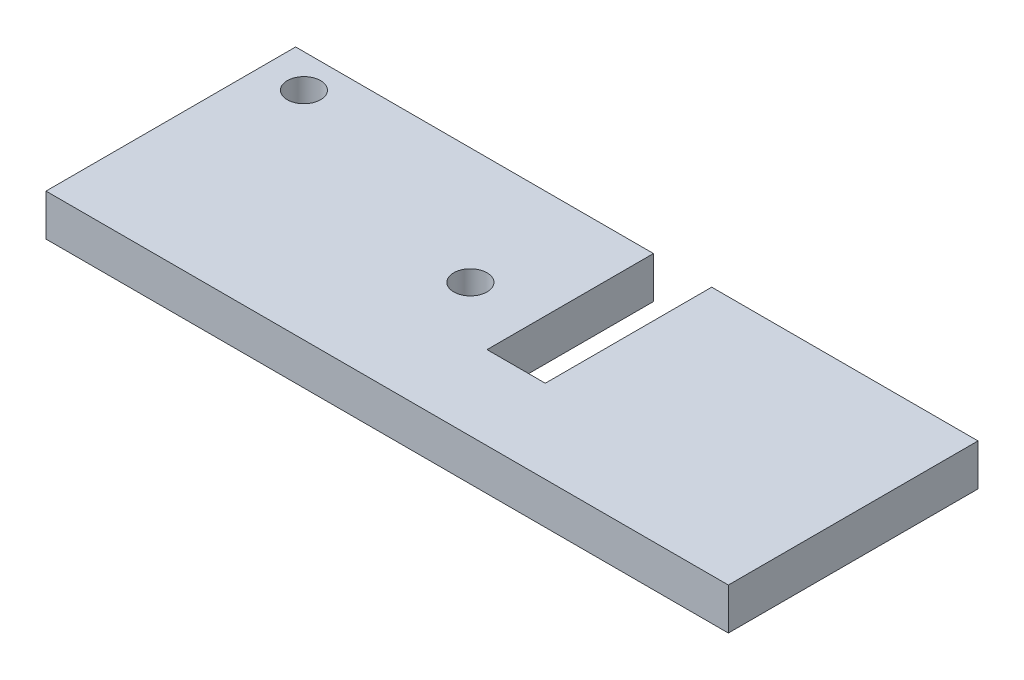
ISO-10303-21;
HEADER;
FILE_DESCRIPTION(('STEP AP214'),'2;1');
FILE_NAME('part.step','',(''),(''),'','','');
FILE_SCHEMA(('AUTOMOTIVE_DESIGN { 1 0 10303 214 1 1 1 1 }'));
ENDSEC;
DATA;
#1=APPLICATION_CONTEXT('core data for automotive mechanical design processes');
#2=APPLICATION_PROTOCOL_DEFINITION('international standard','automotive_design',2000,#1);
#3=PRODUCT_CONTEXT('',#1,'mechanical');
#4=PRODUCT('Part','Part','',(#3));
#5=PRODUCT_RELATED_PRODUCT_CATEGORY('part','',(#4));
#6=PRODUCT_DEFINITION_FORMATION('','',#4);
#7=PRODUCT_DEFINITION_CONTEXT('part definition',#1,'design');
#8=PRODUCT_DEFINITION('design','',#6,#7);
#9=PRODUCT_DEFINITION_SHAPE('','',#8);
#10=(LENGTH_UNIT() NAMED_UNIT(*) SI_UNIT(.MILLI.,.METRE.));
#11=(NAMED_UNIT(*) PLANE_ANGLE_UNIT() SI_UNIT($,.RADIAN.));
#12=(NAMED_UNIT(*) SI_UNIT($,.STERADIAN.) SOLID_ANGLE_UNIT());
#13=UNCERTAINTY_MEASURE_WITH_UNIT(LENGTH_MEASURE(1.E-05),#10,'distance_accuracy_value','');
#14=(GEOMETRIC_REPRESENTATION_CONTEXT(3) GLOBAL_UNCERTAINTY_ASSIGNED_CONTEXT((#13)) GLOBAL_UNIT_ASSIGNED_CONTEXT((#10,
#11,#12)) REPRESENTATION_CONTEXT('',''));
#15=CARTESIAN_POINT('',(0.,0.,0.));
#16=DIRECTION('',(0.,0.,1.));
#17=DIRECTION('',(1.,0.,0.));
#18=AXIS2_PLACEMENT_3D('',#15,#16,#17);
#19=CARTESIAN_POINT('',(0.,-5.,0.));
#20=DIRECTION('',(-1.,0.,0.));
#21=DIRECTION('',(0.,0.,1.));
#22=AXIS2_PLACEMENT_3D('',#19,#20,#21);
#23=PLANE('',#22);
#24=DIRECTION('',(0.,0.,1.));
#25=VECTOR('',#24,1.);
#26=CARTESIAN_POINT('',(0.,0.,0.));
#27=LINE('',#26,#25);
#28=CARTESIAN_POINT('',(0.,0.,-30.));
#29=VERTEX_POINT('',#28);
#30=CARTESIAN_POINT('',(0.,0.,0.));
#31=VERTEX_POINT('',#30);
#32=EDGE_CURVE('E143',#29,#31,#27,.T.);
#33=ORIENTED_EDGE('',*,*,#32,.F.);
#34=DIRECTION('',(0.,1.,0.));
#35=VECTOR('',#34,1.);
#36=CARTESIAN_POINT('',(0.,-5.,-30.));
#37=LINE('',#36,#35);
#38=CARTESIAN_POINT('',(0.,-5.,-30.));
#39=VERTEX_POINT('',#38);
#40=EDGE_CURVE('E11',#39,#29,#37,.T.);
#41=ORIENTED_EDGE('',*,*,#40,.F.);
#42=DIRECTION('',(0.,0.,1.));
#43=VECTOR('',#42,1.);
#44=CARTESIAN_POINT('',(0.,-5.,0.));
#45=LINE('',#44,#43);
#46=CARTESIAN_POINT('',(0.,-5.,0.));
#47=VERTEX_POINT('',#46);
#48=EDGE_CURVE('E172',#39,#47,#45,.T.);
#49=ORIENTED_EDGE('',*,*,#48,.T.);
#50=DIRECTION('',(0.,1.,0.));
#51=VECTOR('',#50,1.);
#52=CARTESIAN_POINT('',(0.,-5.,0.));
#53=LINE('',#52,#51);
#54=EDGE_CURVE('E41',#47,#31,#53,.T.);
#55=ORIENTED_EDGE('',*,*,#54,.T.);
#56=EDGE_LOOP('',(#33,#41,#49,#55));
#57=FACE_BOUND('',#56,.T.);
#58=ADVANCED_FACE('F38',(#57),#23,.T.);
#59=CARTESIAN_POINT('',(0.,-5.,-30.));
#60=DIRECTION('',(0.,0.,-1.));
#61=DIRECTION('',(-1.,0.,0.));
#62=AXIS2_PLACEMENT_3D('',#59,#60,#61);
#63=PLANE('',#62);
#64=DIRECTION('',(-1.,0.,0.));
#65=VECTOR('',#64,1.);
#66=CARTESIAN_POINT('',(0.,0.,-30.));
#67=LINE('',#66,#65);
#68=CARTESIAN_POINT('',(43.,0.,-30.));
#69=VERTEX_POINT('',#68);
#70=EDGE_CURVE('E169',#69,#29,#67,.T.);
#71=ORIENTED_EDGE('',*,*,#70,.F.);
#72=DIRECTION('',(0.,1.,0.));
#73=VECTOR('',#72,1.);
#74=CARTESIAN_POINT('',(43.,-5.,-30.));
#75=LINE('',#74,#73);
#76=CARTESIAN_POINT('',(43.,-5.,-30.));
#77=VERTEX_POINT('',#76);
#78=EDGE_CURVE('E48',#77,#69,#75,.T.);
#79=ORIENTED_EDGE('',*,*,#78,.F.);
#80=DIRECTION('',(-1.,0.,0.));
#81=VECTOR('',#80,1.);
#82=CARTESIAN_POINT('',(0.,-5.,-30.));
#83=LINE('',#82,#81);
#84=EDGE_CURVE('E127',#77,#39,#83,.T.);
#85=ORIENTED_EDGE('',*,*,#84,.T.);
#86=ORIENTED_EDGE('',*,*,#40,.T.);
#87=EDGE_LOOP('',(#71,#79,#85,#86));
#88=FACE_BOUND('',#87,.T.);
#89=ADVANCED_FACE('F194',(#88),#63,.T.);
#90=CARTESIAN_POINT('',(43.,-5.,-30.));
#91=DIRECTION('',(1.,0.,0.));
#92=DIRECTION('',(0.,0.,-1.));
#93=AXIS2_PLACEMENT_3D('',#90,#91,#92);
#94=PLANE('',#93);
#95=DIRECTION('',(0.,0.,-1.));
#96=VECTOR('',#95,1.);
#97=CARTESIAN_POINT('',(43.,0.,-30.));
#98=LINE('',#97,#96);
#99=CARTESIAN_POINT('',(43.,0.,-10.));
#100=VERTEX_POINT('',#99);
#101=EDGE_CURVE('E113',#100,#69,#98,.T.);
#102=ORIENTED_EDGE('',*,*,#101,.F.);
#103=DIRECTION('',(0.,1.,0.));
#104=VECTOR('',#103,1.);
#105=CARTESIAN_POINT('',(43.,-5.,-10.));
#106=LINE('',#105,#104);
#107=CARTESIAN_POINT('',(43.,-5.,-10.));
#108=VERTEX_POINT('',#107);
#109=EDGE_CURVE('E108',#108,#100,#106,.T.);
#110=ORIENTED_EDGE('',*,*,#109,.F.);
#111=DIRECTION('',(0.,0.,-1.));
#112=VECTOR('',#111,1.);
#113=CARTESIAN_POINT('',(43.,-5.,-30.));
#114=LINE('',#113,#112);
#115=EDGE_CURVE('E111',#108,#77,#114,.T.);
#116=ORIENTED_EDGE('',*,*,#115,.T.);
#117=ORIENTED_EDGE('',*,*,#78,.T.);
#118=EDGE_LOOP('',(#102,#110,#116,#117));
#119=FACE_BOUND('',#118,.T.);
#120=ADVANCED_FACE('F110',(#119),#94,.T.);
#121=CARTESIAN_POINT('',(43.,-5.,-10.));
#122=DIRECTION('',(0.,0.,-1.));
#123=DIRECTION('',(-1.,0.,0.));
#124=AXIS2_PLACEMENT_3D('',#121,#122,#123);
#125=PLANE('',#124);
#126=DIRECTION('',(-1.,0.,0.));
#127=VECTOR('',#126,1.);
#128=CARTESIAN_POINT('',(43.,0.,-10.));
#129=LINE('',#128,#127);
#130=CARTESIAN_POINT('',(50.,0.,-10.));
#131=VERTEX_POINT('',#130);
#132=EDGE_CURVE('E164',#131,#100,#129,.T.);
#133=ORIENTED_EDGE('',*,*,#132,.F.);
#134=DIRECTION('',(0.,1.,0.));
#135=VECTOR('',#134,1.);
#136=CARTESIAN_POINT('',(50.,-5.,-10.));
#137=LINE('',#136,#135);
#138=CARTESIAN_POINT('',(50.,-5.,-10.));
#139=VERTEX_POINT('',#138);
#140=EDGE_CURVE('E119',#139,#131,#137,.T.);
#141=ORIENTED_EDGE('',*,*,#140,.F.);
#142=DIRECTION('',(-1.,0.,0.));
#143=VECTOR('',#142,1.);
#144=CARTESIAN_POINT('',(43.,-5.,-10.));
#145=LINE('',#144,#143);
#146=EDGE_CURVE('E125',#139,#108,#145,.T.);
#147=ORIENTED_EDGE('',*,*,#146,.T.);
#148=ORIENTED_EDGE('',*,*,#109,.T.);
#149=EDGE_LOOP('',(#133,#141,#147,#148));
#150=FACE_BOUND('',#149,.T.);
#151=ADVANCED_FACE('F130',(#150),#125,.T.);
#152=CARTESIAN_POINT('',(50.,-5.,-30.));
#153=DIRECTION('',(-1.,0.,0.));
#154=DIRECTION('',(0.,0.,1.));
#155=AXIS2_PLACEMENT_3D('',#152,#153,#154);
#156=PLANE('',#155);
#157=DIRECTION('',(0.,0.,1.));
#158=VECTOR('',#157,1.);
#159=CARTESIAN_POINT('',(50.,0.,-30.));
#160=LINE('',#159,#158);
#161=CARTESIAN_POINT('',(50.,0.,-30.));
#162=VERTEX_POINT('',#161);
#163=EDGE_CURVE('E160',#162,#131,#160,.T.);
#164=ORIENTED_EDGE('',*,*,#163,.F.);
#165=DIRECTION('',(0.,1.,0.));
#166=VECTOR('',#165,1.);
#167=CARTESIAN_POINT('',(50.,-5.,-30.));
#168=LINE('',#167,#166);
#169=CARTESIAN_POINT('',(50.,-5.,-30.));
#170=VERTEX_POINT('',#169);
#171=EDGE_CURVE('E178',#170,#162,#168,.T.);
#172=ORIENTED_EDGE('',*,*,#171,.F.);
#173=DIRECTION('',(0.,0.,1.));
#174=VECTOR('',#173,1.);
#175=CARTESIAN_POINT('',(50.,-5.,-30.));
#176=LINE('',#175,#174);
#177=EDGE_CURVE('E132',#170,#139,#176,.T.);
#178=ORIENTED_EDGE('',*,*,#177,.T.);
#179=ORIENTED_EDGE('',*,*,#140,.T.);
#180=EDGE_LOOP('',(#164,#172,#178,#179));
#181=FACE_BOUND('',#180,.T.);
#182=ADVANCED_FACE('F207',(#181),#156,.T.);
#183=CARTESIAN_POINT('',(50.,-5.,-30.));
#184=DIRECTION('',(0.,0.,-1.));
#185=DIRECTION('',(-1.,0.,0.));
#186=AXIS2_PLACEMENT_3D('',#183,#184,#185);
#187=PLANE('',#186);
#188=DIRECTION('',(-1.,0.,0.));
#189=VECTOR('',#188,1.);
#190=CARTESIAN_POINT('',(50.,0.,-30.));
#191=LINE('',#190,#189);
#192=CARTESIAN_POINT('',(82.,0.,-30.));
#193=VERTEX_POINT('',#192);
#194=EDGE_CURVE('E156',#193,#162,#191,.T.);
#195=ORIENTED_EDGE('',*,*,#194,.F.);
#196=DIRECTION('',(0.,1.,0.));
#197=VECTOR('',#196,1.);
#198=CARTESIAN_POINT('',(82.,-5.,-30.));
#199=LINE('',#198,#197);
#200=CARTESIAN_POINT('',(82.,-5.,-30.));
#201=VERTEX_POINT('',#200);
#202=EDGE_CURVE('E181',#201,#193,#199,.T.);
#203=ORIENTED_EDGE('',*,*,#202,.F.);
#204=DIRECTION('',(-1.,0.,0.));
#205=VECTOR('',#204,1.);
#206=CARTESIAN_POINT('',(50.,-5.,-30.));
#207=LINE('',#206,#205);
#208=EDGE_CURVE('E137',#201,#170,#207,.T.);
#209=ORIENTED_EDGE('',*,*,#208,.T.);
#210=ORIENTED_EDGE('',*,*,#171,.T.);
#211=EDGE_LOOP('',(#195,#203,#209,#210));
#212=FACE_BOUND('',#211,.T.);
#213=ADVANCED_FACE('F210',(#212),#187,.T.);
#214=CARTESIAN_POINT('',(82.,-5.,0.));
#215=DIRECTION('',(1.,0.,0.));
#216=DIRECTION('',(0.,0.,-1.));
#217=AXIS2_PLACEMENT_3D('',#214,#215,#216);
#218=PLANE('',#217);
#219=DIRECTION('',(0.,0.,-1.));
#220=VECTOR('',#219,1.);
#221=CARTESIAN_POINT('',(82.,0.,0.));
#222=LINE('',#221,#220);
#223=CARTESIAN_POINT('',(82.,0.,0.));
#224=VERTEX_POINT('',#223);
#225=EDGE_CURVE('E152',#224,#193,#222,.T.);
#226=ORIENTED_EDGE('',*,*,#225,.F.);
#227=DIRECTION('',(0.,1.,0.));
#228=VECTOR('',#227,1.);
#229=CARTESIAN_POINT('',(82.,-5.,0.));
#230=LINE('',#229,#228);
#231=CARTESIAN_POINT('',(82.,-5.,0.));
#232=VERTEX_POINT('',#231);
#233=EDGE_CURVE('E183',#232,#224,#230,.T.);
#234=ORIENTED_EDGE('',*,*,#233,.F.);
#235=DIRECTION('',(0.,0.,-1.));
#236=VECTOR('',#235,1.);
#237=CARTESIAN_POINT('',(82.,-5.,0.));
#238=LINE('',#237,#236);
#239=EDGE_CURVE('E264',#232,#201,#238,.T.);
#240=ORIENTED_EDGE('',*,*,#239,.T.);
#241=ORIENTED_EDGE('',*,*,#202,.T.);
#242=EDGE_LOOP('',(#226,#234,#240,#241));
#243=FACE_BOUND('',#242,.T.);
#244=ADVANCED_FACE('F214',(#243),#218,.T.);
#245=CARTESIAN_POINT('',(0.,-5.,0.));
#246=DIRECTION('',(0.,0.,1.));
#247=DIRECTION('',(1.,0.,0.));
#248=AXIS2_PLACEMENT_3D('',#245,#246,#247);
#249=PLANE('',#248);
#250=DIRECTION('',(1.,0.,0.));
#251=VECTOR('',#250,1.);
#252=CARTESIAN_POINT('',(0.,0.,0.));
#253=LINE('',#252,#251);
#254=EDGE_CURVE('E147',#31,#224,#253,.T.);
#255=ORIENTED_EDGE('',*,*,#254,.F.);
#256=ORIENTED_EDGE('',*,*,#54,.F.);
#257=DIRECTION('',(1.,0.,0.));
#258=VECTOR('',#257,1.);
#259=CARTESIAN_POINT('',(0.,-5.,0.));
#260=LINE('',#259,#258);
#261=EDGE_CURVE('E261',#47,#232,#260,.T.);
#262=ORIENTED_EDGE('',*,*,#261,.T.);
#263=ORIENTED_EDGE('',*,*,#233,.T.);
#264=EDGE_LOOP('',(#255,#256,#262,#263));
#265=FACE_BOUND('',#264,.T.);
#266=ADVANCED_FACE('F191',(#265),#249,.T.);
#267=CARTESIAN_POINT('',(0.,-5.,0.));
#268=DIRECTION('',(0.,-1.,0.));
#269=DIRECTION('',(0.,0.,-1.));
#270=AXIS2_PLACEMENT_3D('',#267,#268,#269);
#271=PLANE('',#270);
#272=CARTESIAN_POINT('',(35.,-5.,-16.));
#273=DIRECTION('',(0.,1.,0.));
#274=DIRECTION('',(0.,0.,1.));
#275=AXIS2_PLACEMENT_3D('',#272,#273,#274);
#276=CIRCLE('',#275,2.00000000000001);
#277=CARTESIAN_POINT('',(35.,-5.,-14.));
#278=VERTEX_POINT('',#277);
#279=EDGE_CURVE('E241',#278,#278,#276,.T.);
#280=ORIENTED_EDGE('',*,*,#279,.T.);
#281=EDGE_LOOP('',(#280));
#282=FACE_BOUND('',#281,.T.);
#283=CARTESIAN_POINT('',(5.,-5.,-26.));
#284=DIRECTION('',(0.,1.,0.));
#285=DIRECTION('',(0.,0.,1.));
#286=AXIS2_PLACEMENT_3D('',#283,#284,#285);
#287=CIRCLE('',#286,2.);
#288=CARTESIAN_POINT('',(5.,-5.,-24.));
#289=VERTEX_POINT('',#288);
#290=EDGE_CURVE('E148',#289,#289,#287,.T.);
#291=ORIENTED_EDGE('',*,*,#290,.T.);
#292=EDGE_LOOP('',(#291));
#293=FACE_BOUND('',#292,.T.);
#294=ORIENTED_EDGE('',*,*,#48,.F.);
#295=ORIENTED_EDGE('',*,*,#84,.F.);
#296=ORIENTED_EDGE('',*,*,#115,.F.);
#297=ORIENTED_EDGE('',*,*,#146,.F.);
#298=ORIENTED_EDGE('',*,*,#177,.F.);
#299=ORIENTED_EDGE('',*,*,#208,.F.);
#300=ORIENTED_EDGE('',*,*,#239,.F.);
#301=ORIENTED_EDGE('',*,*,#261,.F.);
#302=EDGE_LOOP('',(#294,#295,#296,#297,#298,#299,#300,#301));
#303=FACE_BOUND('',#302,.T.);
#304=ADVANCED_FACE('F123',(#282,#293,#303),#271,.T.);
#305=CARTESIAN_POINT('',(0.,0.,0.));
#306=DIRECTION('',(0.,-1.,0.));
#307=DIRECTION('',(0.,0.,-1.));
#308=AXIS2_PLACEMENT_3D('',#305,#306,#307);
#309=PLANE('',#308);
#310=CARTESIAN_POINT('',(35.,0.,-16.));
#311=DIRECTION('',(0.,1.,0.));
#312=DIRECTION('',(0.,0.,1.));
#313=AXIS2_PLACEMENT_3D('',#310,#311,#312);
#314=CIRCLE('',#313,2.00000000000001);
#315=CARTESIAN_POINT('',(35.,0.,-14.));
#316=VERTEX_POINT('',#315);
#317=EDGE_CURVE('E244',#316,#316,#314,.T.);
#318=ORIENTED_EDGE('',*,*,#317,.F.);
#319=EDGE_LOOP('',(#318));
#320=FACE_BOUND('',#319,.T.);
#321=CARTESIAN_POINT('',(5.,0.,-26.));
#322=DIRECTION('',(0.,1.,0.));
#323=DIRECTION('',(0.,0.,1.));
#324=AXIS2_PLACEMENT_3D('',#321,#322,#323);
#325=CIRCLE('',#324,2.);
#326=CARTESIAN_POINT('',(5.,0.,-24.));
#327=VERTEX_POINT('',#326);
#328=EDGE_CURVE('E250',#327,#327,#325,.T.);
#329=ORIENTED_EDGE('',*,*,#328,.F.);
#330=EDGE_LOOP('',(#329));
#331=FACE_BOUND('',#330,.T.);
#332=ORIENTED_EDGE('',*,*,#32,.T.);
#333=ORIENTED_EDGE('',*,*,#254,.T.);
#334=ORIENTED_EDGE('',*,*,#225,.T.);
#335=ORIENTED_EDGE('',*,*,#194,.T.);
#336=ORIENTED_EDGE('',*,*,#163,.T.);
#337=ORIENTED_EDGE('',*,*,#132,.T.);
#338=ORIENTED_EDGE('',*,*,#101,.T.);
#339=ORIENTED_EDGE('',*,*,#70,.T.);
#340=EDGE_LOOP('',(#332,#333,#334,#335,#336,#337,#338,#339));
#341=FACE_BOUND('',#340,.T.);
#342=ADVANCED_FACE('F193',(#320,#331,#341),#309,.F.);
#343=CARTESIAN_POINT('',(5.,-5.,-26.));
#344=DIRECTION('',(0.,1.,0.));
#345=DIRECTION('',(0.,0.,1.));
#346=AXIS2_PLACEMENT_3D('',#343,#344,#345);
#347=CYLINDRICAL_SURFACE('',#346,2.);
#348=ORIENTED_EDGE('',*,*,#290,.F.);
#349=EDGE_LOOP('',(#348));
#350=FACE_BOUND('',#349,.T.);
#351=ORIENTED_EDGE('',*,*,#328,.T.);
#352=EDGE_LOOP('',(#351));
#353=FACE_BOUND('',#352,.T.);
#354=ADVANCED_FACE('F226',(#350,#353),#347,.F.);
#355=CARTESIAN_POINT('',(35.,-5.,-16.));
#356=DIRECTION('',(0.,1.,0.));
#357=DIRECTION('',(0.,0.,1.));
#358=AXIS2_PLACEMENT_3D('',#355,#356,#357);
#359=CYLINDRICAL_SURFACE('',#358,2.00000000000001);
#360=ORIENTED_EDGE('',*,*,#279,.F.);
#361=EDGE_LOOP('',(#360));
#362=FACE_BOUND('',#361,.T.);
#363=ORIENTED_EDGE('',*,*,#317,.T.);
#364=EDGE_LOOP('',(#363));
#365=FACE_BOUND('',#364,.T.);
#366=ADVANCED_FACE('F233',(#362,#365),#359,.F.);
#367=CLOSED_SHELL('',(#58,#89,#120,#151,#182,#213,#244,#266,#304,#342,#354,#366));
#368=MANIFOLD_SOLID_BREP('B2',#367);
#369=ADVANCED_BREP_SHAPE_REPRESENTATION('',(#18,#368),#14);
#370=SHAPE_DEFINITION_REPRESENTATION(#9,#369);
ENDSEC;
END-ISO-10303-21;
